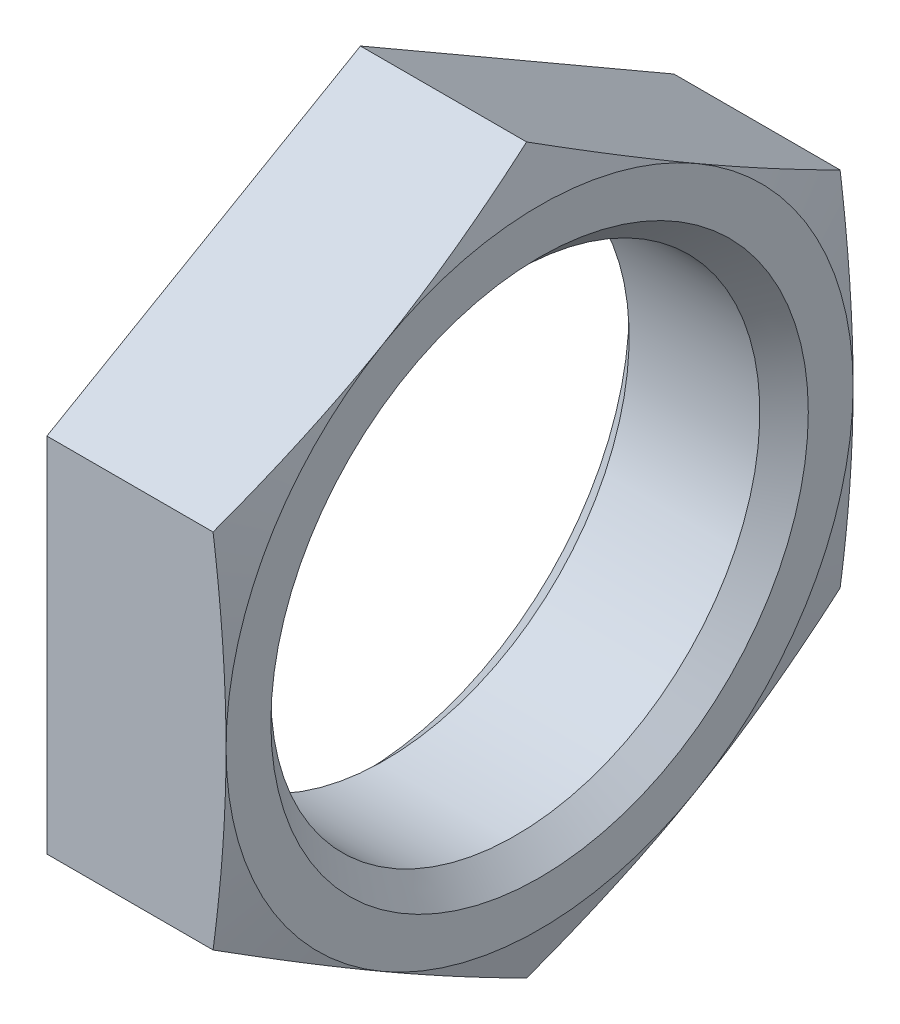
ISO-10303-21;
HEADER;
FILE_DESCRIPTION(('STEP AP214'),'2;1');
FILE_NAME('part.step','',(''),(''),'','','');
FILE_SCHEMA(('AUTOMOTIVE_DESIGN { 1 0 10303 214 1 1 1 1 }'));
ENDSEC;
DATA;
#1=APPLICATION_CONTEXT('core data for automotive mechanical design processes');
#2=APPLICATION_PROTOCOL_DEFINITION('international standard','automotive_design',2000,#1);
#3=PRODUCT_CONTEXT('',#1,'mechanical');
#4=PRODUCT('Part','Part','',(#3));
#5=PRODUCT_RELATED_PRODUCT_CATEGORY('part','',(#4));
#6=PRODUCT_DEFINITION_FORMATION('','',#4);
#7=PRODUCT_DEFINITION_CONTEXT('part definition',#1,'design');
#8=PRODUCT_DEFINITION('design','',#6,#7);
#9=PRODUCT_DEFINITION_SHAPE('','',#8);
#10=(LENGTH_UNIT() NAMED_UNIT(*) SI_UNIT(.MILLI.,.METRE.));
#11=(NAMED_UNIT(*) PLANE_ANGLE_UNIT() SI_UNIT($,.RADIAN.));
#12=(NAMED_UNIT(*) SI_UNIT($,.STERADIAN.) SOLID_ANGLE_UNIT());
#13=UNCERTAINTY_MEASURE_WITH_UNIT(LENGTH_MEASURE(1.E-05),#10,'distance_accuracy_value','');
#14=(GEOMETRIC_REPRESENTATION_CONTEXT(3) GLOBAL_UNCERTAINTY_ASSIGNED_CONTEXT((#13)) GLOBAL_UNIT_ASSIGNED_CONTEXT((#10,
#11,#12)) REPRESENTATION_CONTEXT('',''));
#15=CARTESIAN_POINT('',(0.,0.,0.));
#16=DIRECTION('',(0.,0.,1.));
#17=DIRECTION('',(1.,0.,0.));
#18=AXIS2_PLACEMENT_3D('',#15,#16,#17);
#19=CARTESIAN_POINT('',(4.,-8.0829037686548,0.));
#20=DIRECTION('',(0.,0.866025403784438,0.5));
#21=DIRECTION('',(1.,0.,0.));
#22=AXIS2_PLACEMENT_3D('',#19,#20,#21);
#23=PLANE('',#22);
#24=DIRECTION('',(0.,0.5,-0.866025403784438));
#25=VECTOR('',#24,1.);
#26=CARTESIAN_POINT('',(-2.,-6.06217782649109,-3.5));
#27=LINE('',#26,#25);
#28=CARTESIAN_POINT('',(-2.,-8.0829037686548,0.));
#29=VERTEX_POINT('',#28);
#30=CARTESIAN_POINT('',(-2.,-4.0414518843274,-7.));
#31=VERTEX_POINT('',#30);
#32=EDGE_CURVE('E362',#29,#31,#27,.T.);
#33=ORIENTED_EDGE('',*,*,#32,.T.);
#34=DIRECTION('',(-1.,0.,0.));
#35=VECTOR('',#34,1.);
#36=CARTESIAN_POINT('',(4.,-4.0414518843274,-7.));
#37=LINE('',#36,#35);
#38=CARTESIAN_POINT('',(1.70983680970831,-4.0414518843274,-7.));
#39=VERTEX_POINT('',#38);
#40=EDGE_CURVE('E11',#39,#31,#37,.T.);
#41=ORIENTED_EDGE('',*,*,#40,.F.);
#42=CARTESIAN_POINT('',(1.70983680970852,-4.04145188432742,-7.));
#43=CARTESIAN_POINT('',(2.,-5.12435565298139,-5.12435565298351));
#44=CARTESIAN_POINT('',(2.,-6.06217782649109,-3.50000000000003));
#45=B_SPLINE_CURVE_WITH_KNOTS('',2,(#42,#43,#44),.UNSPECIFIED.,.F.,.F.,(3,3),(0.,1.),.UNSPECIFIED.);
#46=CARTESIAN_POINT('',(2.,-6.06217782649109,-3.5));
#47=VERTEX_POINT('',#46);
#48=EDGE_CURVE('E130',#39,#47,#45,.T.);
#49=ORIENTED_EDGE('',*,*,#48,.T.);
#50=CARTESIAN_POINT('',(2.,-6.06217782649109,-3.50000000000003));
#51=CARTESIAN_POINT('',(2.,-7.00000000000084,-1.87564434701648));
#52=CARTESIAN_POINT('',(1.70983680970851,-8.0829037686548,0.));
#53=B_SPLINE_CURVE_WITH_KNOTS('',2,(#50,#51,#52),.UNSPECIFIED.,.F.,.F.,(3,3),(0.,1.),.UNSPECIFIED.);
#54=CARTESIAN_POINT('',(1.70983680970831,-8.0829037686548,0.));
#55=VERTEX_POINT('',#54);
#56=EDGE_CURVE('E205',#47,#55,#53,.T.);
#57=ORIENTED_EDGE('',*,*,#56,.T.);
#58=DIRECTION('',(-1.,0.,0.));
#59=VECTOR('',#58,1.);
#60=CARTESIAN_POINT('',(4.,-8.0829037686548,0.));
#61=LINE('',#60,#59);
#62=EDGE_CURVE('E167',#55,#29,#61,.T.);
#63=ORIENTED_EDGE('',*,*,#62,.T.);
#64=EDGE_LOOP('',(#33,#41,#49,#57,#63));
#65=FACE_BOUND('',#64,.T.);
#66=ADVANCED_FACE('F16',(#65),#23,.F.);
#67=CARTESIAN_POINT('',(4.,-4.0414518843274,-7.));
#68=DIRECTION('',(0.,0.,1.));
#69=DIRECTION('',(1.,0.,0.));
#70=AXIS2_PLACEMENT_3D('',#67,#68,#69);
#71=PLANE('',#70);
#72=DIRECTION('',(0.,1.,0.));
#73=VECTOR('',#72,1.);
#74=CARTESIAN_POINT('',(-2.,0.,-7.));
#75=LINE('',#74,#73);
#76=CARTESIAN_POINT('',(-2.,4.0414518843274,-7.));
#77=VERTEX_POINT('',#76);
#78=EDGE_CURVE('E353',#31,#77,#75,.T.);
#79=ORIENTED_EDGE('',*,*,#78,.T.);
#80=DIRECTION('',(-1.,0.,0.));
#81=VECTOR('',#80,1.);
#82=CARTESIAN_POINT('',(4.,4.0414518843274,-7.));
#83=LINE('',#82,#81);
#84=CARTESIAN_POINT('',(1.70983680970831,4.0414518843274,-7.));
#85=VERTEX_POINT('',#84);
#86=EDGE_CURVE('E30',#85,#77,#83,.T.);
#87=ORIENTED_EDGE('',*,*,#86,.F.);
#88=CARTESIAN_POINT('',(1.70983680970831,4.0414518843274,-7.));
#89=CARTESIAN_POINT('',(2.,1.87564434701792,-7.));
#90=CARTESIAN_POINT('',(2.,0.,-7.));
#91=B_SPLINE_CURVE_WITH_KNOTS('',2,(#88,#89,#90),.UNSPECIFIED.,.F.,.F.,(3,3),(0.,1.),.UNSPECIFIED.);
#92=CARTESIAN_POINT('',(2.,0.,-7.));
#93=VERTEX_POINT('',#92);
#94=EDGE_CURVE('E246',#85,#93,#91,.T.);
#95=ORIENTED_EDGE('',*,*,#94,.T.);
#96=CARTESIAN_POINT('',(2.,0.,-7.));
#97=CARTESIAN_POINT('',(2.,-1.87564434701782,-7.));
#98=CARTESIAN_POINT('',(1.70983680970831,-4.0414518843274,-7.));
#99=B_SPLINE_CURVE_WITH_KNOTS('',2,(#96,#97,#98),.UNSPECIFIED.,.F.,.F.,(3,3),(0.,1.),.UNSPECIFIED.);
#100=EDGE_CURVE('E339',#93,#39,#99,.T.);
#101=ORIENTED_EDGE('',*,*,#100,.T.);
#102=ORIENTED_EDGE('',*,*,#40,.T.);
#103=EDGE_LOOP('',(#79,#87,#95,#101,#102));
#104=FACE_BOUND('',#103,.T.);
#105=ADVANCED_FACE('F183',(#104),#71,.F.);
#106=CARTESIAN_POINT('',(4.,4.0414518843274,-7.));
#107=DIRECTION('',(0.,-0.866025403784438,0.5));
#108=DIRECTION('',(-1.,0.,0.));
#109=AXIS2_PLACEMENT_3D('',#106,#107,#108);
#110=PLANE('',#109);
#111=DIRECTION('',(0.,0.5,0.866025403784438));
#112=VECTOR('',#111,1.);
#113=CARTESIAN_POINT('',(-2.,6.06217782649109,-3.5));
#114=LINE('',#113,#112);
#115=CARTESIAN_POINT('',(-2.,8.0829037686548,0.));
#116=VERTEX_POINT('',#115);
#117=EDGE_CURVE('E350',#77,#116,#114,.T.);
#118=ORIENTED_EDGE('',*,*,#117,.T.);
#119=DIRECTION('',(-1.,0.,0.));
#120=VECTOR('',#119,1.);
#121=CARTESIAN_POINT('',(4.,8.0829037686548,0.));
#122=LINE('',#121,#120);
#123=CARTESIAN_POINT('',(1.70983680970831,8.0829037686548,0.));
#124=VERTEX_POINT('',#123);
#125=EDGE_CURVE('E60',#124,#116,#122,.T.);
#126=ORIENTED_EDGE('',*,*,#125,.F.);
#127=CARTESIAN_POINT('',(1.70983680970851,8.08290376865478,0.));
#128=CARTESIAN_POINT('',(2.,7.00000000000081,-1.87564434701649));
#129=CARTESIAN_POINT('',(2.,6.06217782649108,-3.50000000000003));
#130=B_SPLINE_CURVE_WITH_KNOTS('',2,(#127,#128,#129),.UNSPECIFIED.,.F.,.F.,(3,3),(0.,1.),.UNSPECIFIED.);
#131=CARTESIAN_POINT('',(2.,6.06217782649109,-3.5));
#132=VERTEX_POINT('',#131);
#133=EDGE_CURVE('E300',#124,#132,#130,.T.);
#134=ORIENTED_EDGE('',*,*,#133,.T.);
#135=CARTESIAN_POINT('',(2.,6.06217782649108,-3.50000000000003));
#136=CARTESIAN_POINT('',(2.,5.12435565298138,-5.1243556529835));
#137=CARTESIAN_POINT('',(1.70983680970852,4.0414518843274,-7.));
#138=B_SPLINE_CURVE_WITH_KNOTS('',2,(#135,#136,#137),.UNSPECIFIED.,.F.,.F.,(3,3),(0.,1.),.UNSPECIFIED.);
#139=EDGE_CURVE('E247',#132,#85,#138,.T.);
#140=ORIENTED_EDGE('',*,*,#139,.T.);
#141=ORIENTED_EDGE('',*,*,#86,.T.);
#142=EDGE_LOOP('',(#118,#126,#134,#140,#141));
#143=FACE_BOUND('',#142,.T.);
#144=ADVANCED_FACE('F309',(#143),#110,.F.);
#145=CARTESIAN_POINT('',(4.,8.0829037686548,0.));
#146=DIRECTION('',(0.,-0.866025403784438,-0.5));
#147=DIRECTION('',(0.,0.5,-0.866025403784438));
#148=AXIS2_PLACEMENT_3D('',#145,#146,#147);
#149=PLANE('',#148);
#150=DIRECTION('',(0.,-0.5,0.866025403784438));
#151=VECTOR('',#150,1.);
#152=CARTESIAN_POINT('',(-2.,6.06217782649109,3.5));
#153=LINE('',#152,#151);
#154=CARTESIAN_POINT('',(-2.,4.0414518843274,7.));
#155=VERTEX_POINT('',#154);
#156=EDGE_CURVE('E163',#116,#155,#153,.T.);
#157=ORIENTED_EDGE('',*,*,#156,.T.);
#158=DIRECTION('',(-1.,0.,0.));
#159=VECTOR('',#158,1.);
#160=CARTESIAN_POINT('',(4.,4.0414518843274,7.));
#161=LINE('',#160,#159);
#162=CARTESIAN_POINT('',(1.70983680970831,4.0414518843274,7.));
#163=VERTEX_POINT('',#162);
#164=EDGE_CURVE('E345',#163,#155,#161,.T.);
#165=ORIENTED_EDGE('',*,*,#164,.F.);
#166=CARTESIAN_POINT('',(1.70983680970852,4.04145188432742,7.));
#167=CARTESIAN_POINT('',(2.,5.12435565298139,5.12435565298351));
#168=CARTESIAN_POINT('',(2.,6.06217782649109,3.50000000000003));
#169=B_SPLINE_CURVE_WITH_KNOTS('',2,(#166,#167,#168),.UNSPECIFIED.,.F.,.F.,(3,3),(0.,1.),.UNSPECIFIED.);
#170=CARTESIAN_POINT('',(2.,6.06217782649109,3.5));
#171=VERTEX_POINT('',#170);
#172=EDGE_CURVE('E396',#163,#171,#169,.T.);
#173=ORIENTED_EDGE('',*,*,#172,.T.);
#174=CARTESIAN_POINT('',(2.,6.06217782649109,3.50000000000003));
#175=CARTESIAN_POINT('',(2.,7.00000000000084,1.87564434701648));
#176=CARTESIAN_POINT('',(1.70983680970851,8.0829037686548,0.));
#177=B_SPLINE_CURVE_WITH_KNOTS('',2,(#174,#175,#176),.UNSPECIFIED.,.F.,.F.,(3,3),(0.,1.),.UNSPECIFIED.);
#178=EDGE_CURVE('E301',#171,#124,#177,.T.);
#179=ORIENTED_EDGE('',*,*,#178,.T.);
#180=ORIENTED_EDGE('',*,*,#125,.T.);
#181=EDGE_LOOP('',(#157,#165,#173,#179,#180));
#182=FACE_BOUND('',#181,.T.);
#183=ADVANCED_FACE('F317',(#182),#149,.F.);
#184=CARTESIAN_POINT('',(4.,4.0414518843274,7.));
#185=DIRECTION('',(0.,0.,-1.));
#186=DIRECTION('',(0.,-1.,0.));
#187=AXIS2_PLACEMENT_3D('',#184,#185,#186);
#188=PLANE('',#187);
#189=DIRECTION('',(0.,-1.,0.));
#190=VECTOR('',#189,1.);
#191=CARTESIAN_POINT('',(-2.,0.,7.));
#192=LINE('',#191,#190);
#193=CARTESIAN_POINT('',(-2.,-4.0414518843274,7.));
#194=VERTEX_POINT('',#193);
#195=EDGE_CURVE('E162',#155,#194,#192,.T.);
#196=ORIENTED_EDGE('',*,*,#195,.T.);
#197=DIRECTION('',(-1.,0.,0.));
#198=VECTOR('',#197,1.);
#199=CARTESIAN_POINT('',(4.,-4.0414518843274,7.));
#200=LINE('',#199,#198);
#201=CARTESIAN_POINT('',(1.70983680970831,-4.0414518843274,7.));
#202=VERTEX_POINT('',#201);
#203=EDGE_CURVE('E116',#202,#194,#200,.T.);
#204=ORIENTED_EDGE('',*,*,#203,.F.);
#205=CARTESIAN_POINT('',(1.70983680970831,-4.0414518843274,7.));
#206=CARTESIAN_POINT('',(2.,-1.87564434701782,7.));
#207=CARTESIAN_POINT('',(2.,0.,7.));
#208=B_SPLINE_CURVE_WITH_KNOTS('',2,(#205,#206,#207),.UNSPECIFIED.,.F.,.F.,(3,3),(0.,1.),.UNSPECIFIED.);
#209=CARTESIAN_POINT('',(2.,0.,7.));
#210=VERTEX_POINT('',#209);
#211=EDGE_CURVE('E376',#202,#210,#208,.T.);
#212=ORIENTED_EDGE('',*,*,#211,.T.);
#213=CARTESIAN_POINT('',(2.,0.,7.));
#214=CARTESIAN_POINT('',(2.,1.87564434701791,7.));
#215=CARTESIAN_POINT('',(1.70983680970831,4.0414518843274,7.));
#216=B_SPLINE_CURVE_WITH_KNOTS('',2,(#213,#214,#215),.UNSPECIFIED.,.F.,.F.,(3,3),(0.,1.),.UNSPECIFIED.);
#217=EDGE_CURVE('E381',#210,#163,#216,.T.);
#218=ORIENTED_EDGE('',*,*,#217,.T.);
#219=ORIENTED_EDGE('',*,*,#164,.T.);
#220=EDGE_LOOP('',(#196,#204,#212,#218,#219));
#221=FACE_BOUND('',#220,.T.);
#222=ADVANCED_FACE('F427',(#221),#188,.F.);
#223=CARTESIAN_POINT('',(4.,-4.0414518843274,7.));
#224=DIRECTION('',(0.,0.866025403784438,-0.5));
#225=DIRECTION('',(-1.,0.,0.));
#226=AXIS2_PLACEMENT_3D('',#223,#224,#225);
#227=PLANE('',#226);
#228=DIRECTION('',(0.,-0.5,-0.866025403784438));
#229=VECTOR('',#228,1.);
#230=CARTESIAN_POINT('',(-2.,-6.06217782649109,3.5));
#231=LINE('',#230,#229);
#232=EDGE_CURVE('E164',#194,#29,#231,.T.);
#233=ORIENTED_EDGE('',*,*,#232,.T.);
#234=ORIENTED_EDGE('',*,*,#62,.F.);
#235=CARTESIAN_POINT('',(1.70983680970851,-8.08290376865478,0.));
#236=CARTESIAN_POINT('',(2.,-7.00000000000081,1.87564434701649));
#237=CARTESIAN_POINT('',(2.,-6.06217782649108,3.50000000000003));
#238=B_SPLINE_CURVE_WITH_KNOTS('',2,(#235,#236,#237),.UNSPECIFIED.,.F.,.F.,(3,3),(0.,1.),.UNSPECIFIED.);
#239=CARTESIAN_POINT('',(2.,-6.06217782649109,3.5));
#240=VERTEX_POINT('',#239);
#241=EDGE_CURVE('E447',#55,#240,#238,.T.);
#242=ORIENTED_EDGE('',*,*,#241,.T.);
#243=CARTESIAN_POINT('',(2.,-6.06217782649108,3.50000000000003));
#244=CARTESIAN_POINT('',(2.,-5.12435565298138,5.1243556529835));
#245=CARTESIAN_POINT('',(1.70983680970852,-4.0414518843274,7.));
#246=B_SPLINE_CURVE_WITH_KNOTS('',2,(#243,#244,#245),.UNSPECIFIED.,.F.,.F.,(3,3),(0.,1.),.UNSPECIFIED.);
#247=EDGE_CURVE('E377',#240,#202,#246,.T.);
#248=ORIENTED_EDGE('',*,*,#247,.T.);
#249=ORIENTED_EDGE('',*,*,#203,.T.);
#250=EDGE_LOOP('',(#233,#234,#242,#248,#249));
#251=FACE_BOUND('',#250,.T.);
#252=ADVANCED_FACE('F18',(#251),#227,.F.);
#253=CARTESIAN_POINT('',(1.4585,0.,0.));
#254=DIRECTION('',(1.,0.,0.));
#255=DIRECTION('',(0.,0.,-1.));
#256=AXIS2_PLACEMENT_3D('',#253,#254,#255);
#257=CONICAL_SURFACE('',#256,5.4585,0.7853981625);
#258=CARTESIAN_POINT('',(1.4585,0.,0.));
#259=DIRECTION('',(-1.,0.,0.));
#260=DIRECTION('',(0.,0.,1.));
#261=AXIS2_PLACEMENT_3D('',#258,#259,#260);
#262=CIRCLE('',#261,5.4585);
#263=CARTESIAN_POINT('',(1.4585,0.,5.4585));
#264=VERTEX_POINT('',#263);
#265=EDGE_CURVE('E42',#264,#264,#262,.T.);
#266=ORIENTED_EDGE('',*,*,#265,.T.);
#267=EDGE_LOOP('',(#266));
#268=FACE_BOUND('',#267,.T.);
#269=CARTESIAN_POINT('',(2.,0.,0.));
#270=DIRECTION('',(-1.,0.,0.));
#271=DIRECTION('',(0.,0.,1.));
#272=AXIS2_PLACEMENT_3D('',#269,#270,#271);
#273=CIRCLE('',#272,6.);
#274=CARTESIAN_POINT('',(2.,0.,6.));
#275=VERTEX_POINT('',#274);
#276=EDGE_CURVE('E145',#275,#275,#273,.T.);
#277=ORIENTED_EDGE('',*,*,#276,.F.);
#278=EDGE_LOOP('',(#277));
#279=FACE_BOUND('',#278,.T.);
#280=ADVANCED_FACE('F575',(#268,#279),#257,.F.);
#281=CARTESIAN_POINT('',(2.,0.,0.));
#282=DIRECTION('',(-1.,0.,0.));
#283=DIRECTION('',(0.,0.,1.));
#284=AXIS2_PLACEMENT_3D('',#281,#282,#283);
#285=CYLINDRICAL_SURFACE('',#284,5.4585);
#286=CARTESIAN_POINT('',(-1.4585,0.,0.));
#287=DIRECTION('',(-1.,0.,0.));
#288=DIRECTION('',(0.,0.,1.));
#289=AXIS2_PLACEMENT_3D('',#286,#287,#288);
#290=CIRCLE('',#289,5.4585);
#291=CARTESIAN_POINT('',(-1.4585,0.,5.4585));
#292=VERTEX_POINT('',#291);
#293=EDGE_CURVE('E149',#292,#292,#290,.T.);
#294=ORIENTED_EDGE('',*,*,#293,.T.);
#295=EDGE_LOOP('',(#294));
#296=FACE_BOUND('',#295,.T.);
#297=ORIENTED_EDGE('',*,*,#265,.F.);
#298=EDGE_LOOP('',(#297));
#299=FACE_BOUND('',#298,.T.);
#300=ADVANCED_FACE('F184',(#296,#299),#285,.F.);
#301=CARTESIAN_POINT('',(-2.,0.,0.));
#302=DIRECTION('',(-1.,0.,0.));
#303=DIRECTION('',(0.,0.,1.));
#304=AXIS2_PLACEMENT_3D('',#301,#302,#303);
#305=CONICAL_SURFACE('',#304,6.,0.7853981625);
#306=CARTESIAN_POINT('',(-2.,0.,0.));
#307=DIRECTION('',(-1.,0.,0.));
#308=DIRECTION('',(0.,0.,1.));
#309=AXIS2_PLACEMENT_3D('',#306,#307,#308);
#310=CIRCLE('',#309,6.);
#311=CARTESIAN_POINT('',(-2.,0.,6.));
#312=VERTEX_POINT('',#311);
#313=EDGE_CURVE('E160',#312,#312,#310,.T.);
#314=ORIENTED_EDGE('',*,*,#313,.T.);
#315=EDGE_LOOP('',(#314));
#316=FACE_BOUND('',#315,.T.);
#317=ORIENTED_EDGE('',*,*,#293,.F.);
#318=EDGE_LOOP('',(#317));
#319=FACE_BOUND('',#318,.T.);
#320=ADVANCED_FACE('F284',(#316,#319),#305,.F.);
#321=CARTESIAN_POINT('',(2.,7.,0.));
#322=DIRECTION('',(1.,0.,0.));
#323=DIRECTION('',(0.,1.,0.));
#324=AXIS2_PLACEMENT_3D('',#321,#322,#323);
#325=PLANE('',#324);
#326=CARTESIAN_POINT('',(2.,0.,0.));
#327=DIRECTION('',(-1.,0.,0.));
#328=DIRECTION('',(0.,0.,1.));
#329=AXIS2_PLACEMENT_3D('',#326,#327,#328);
#330=CIRCLE('',#329,7.);
#331=EDGE_CURVE('E391',#210,#171,#330,.T.);
#332=ORIENTED_EDGE('',*,*,#331,.F.);
#333=CARTESIAN_POINT('',(2.,0.,0.));
#334=DIRECTION('',(-1.,0.,0.));
#335=DIRECTION('',(0.,0.,1.));
#336=AXIS2_PLACEMENT_3D('',#333,#334,#335);
#337=CIRCLE('',#336,7.);
#338=EDGE_CURVE('E372',#240,#210,#337,.T.);
#339=ORIENTED_EDGE('',*,*,#338,.F.);
#340=CARTESIAN_POINT('',(2.,0.,0.));
#341=DIRECTION('',(-1.,0.,0.));
#342=DIRECTION('',(0.,0.,1.));
#343=AXIS2_PLACEMENT_3D('',#340,#341,#342);
#344=CIRCLE('',#343,7.);
#345=EDGE_CURVE('E385',#47,#240,#344,.T.);
#346=ORIENTED_EDGE('',*,*,#345,.F.);
#347=CARTESIAN_POINT('',(2.,0.,0.));
#348=DIRECTION('',(-1.,0.,0.));
#349=DIRECTION('',(0.,0.,1.));
#350=AXIS2_PLACEMENT_3D('',#347,#348,#349);
#351=CIRCLE('',#350,7.);
#352=EDGE_CURVE('E157',#93,#47,#351,.T.);
#353=ORIENTED_EDGE('',*,*,#352,.F.);
#354=CARTESIAN_POINT('',(2.,0.,0.));
#355=DIRECTION('',(-1.,0.,0.));
#356=DIRECTION('',(0.,0.,1.));
#357=AXIS2_PLACEMENT_3D('',#354,#355,#356);
#358=CIRCLE('',#357,7.);
#359=EDGE_CURVE('E237',#132,#93,#358,.T.);
#360=ORIENTED_EDGE('',*,*,#359,.F.);
#361=CARTESIAN_POINT('',(2.,0.,0.));
#362=DIRECTION('',(-1.,0.,0.));
#363=DIRECTION('',(0.,0.,1.));
#364=AXIS2_PLACEMENT_3D('',#361,#362,#363);
#365=CIRCLE('',#364,7.);
#366=EDGE_CURVE('E75',#171,#132,#365,.T.);
#367=ORIENTED_EDGE('',*,*,#366,.F.);
#368=EDGE_LOOP('',(#332,#339,#346,#353,#360,#367));
#369=FACE_BOUND('',#368,.T.);
#370=ORIENTED_EDGE('',*,*,#276,.T.);
#371=EDGE_LOOP('',(#370));
#372=FACE_BOUND('',#371,.T.);
#373=ADVANCED_FACE('F146',(#369,#372),#325,.T.);
#374=CARTESIAN_POINT('',(1.6248711305964,0.,0.));
#375=DIRECTION('',(-1.,0.,0.));
#376=DIRECTION('',(0.,0.,1.));
#377=AXIS2_PLACEMENT_3D('',#374,#375,#376);
#378=CONICAL_SURFACE('',#377,8.4,1.30899693749998);
#379=ORIENTED_EDGE('',*,*,#100,.F.);
#380=ORIENTED_EDGE('',*,*,#352,.T.);
#381=ORIENTED_EDGE('',*,*,#48,.F.);
#382=EDGE_LOOP('',(#379,#380,#381));
#383=FACE_BOUND('',#382,.T.);
#384=ADVANCED_FACE('F222',(#383),#378,.T.);
#385=CARTESIAN_POINT('',(-2.,0.,0.));
#386=DIRECTION('',(-1.,0.,0.));
#387=DIRECTION('',(0.,0.,1.));
#388=AXIS2_PLACEMENT_3D('',#385,#386,#387);
#389=PLANE('',#388);
#390=ORIENTED_EDGE('',*,*,#313,.F.);
#391=EDGE_LOOP('',(#390));
#392=FACE_BOUND('',#391,.T.);
#393=ORIENTED_EDGE('',*,*,#232,.F.);
#394=ORIENTED_EDGE('',*,*,#195,.F.);
#395=ORIENTED_EDGE('',*,*,#156,.F.);
#396=ORIENTED_EDGE('',*,*,#117,.F.);
#397=ORIENTED_EDGE('',*,*,#78,.F.);
#398=ORIENTED_EDGE('',*,*,#32,.F.);
#399=EDGE_LOOP('',(#393,#394,#395,#396,#397,#398));
#400=FACE_BOUND('',#399,.T.);
#401=ADVANCED_FACE('F186',(#392,#400),#389,.T.);
#402=CARTESIAN_POINT('',(1.6248711305964,0.,0.));
#403=DIRECTION('',(-1.,0.,0.));
#404=DIRECTION('',(0.,0.,1.));
#405=AXIS2_PLACEMENT_3D('',#402,#403,#404);
#406=CONICAL_SURFACE('',#405,8.4,1.30899693749998);
#407=ORIENTED_EDGE('',*,*,#139,.F.);
#408=ORIENTED_EDGE('',*,*,#359,.T.);
#409=ORIENTED_EDGE('',*,*,#94,.F.);
#410=EDGE_LOOP('',(#407,#408,#409));
#411=FACE_BOUND('',#410,.T.);
#412=ADVANCED_FACE('F272',(#411),#406,.T.);
#413=CARTESIAN_POINT('',(1.6248711305964,0.,0.));
#414=DIRECTION('',(-1.,0.,0.));
#415=DIRECTION('',(0.,0.,1.));
#416=AXIS2_PLACEMENT_3D('',#413,#414,#415);
#417=CONICAL_SURFACE('',#416,8.4,1.30899693749998);
#418=ORIENTED_EDGE('',*,*,#178,.F.);
#419=ORIENTED_EDGE('',*,*,#366,.T.);
#420=ORIENTED_EDGE('',*,*,#133,.F.);
#421=EDGE_LOOP('',(#418,#419,#420));
#422=FACE_BOUND('',#421,.T.);
#423=ADVANCED_FACE('F282',(#422),#417,.T.);
#424=CARTESIAN_POINT('',(1.6248711305964,0.,0.));
#425=DIRECTION('',(-1.,0.,0.));
#426=DIRECTION('',(0.,0.,1.));
#427=AXIS2_PLACEMENT_3D('',#424,#425,#426);
#428=CONICAL_SURFACE('',#427,8.4,1.30899693749998);
#429=ORIENTED_EDGE('',*,*,#217,.F.);
#430=ORIENTED_EDGE('',*,*,#331,.T.);
#431=ORIENTED_EDGE('',*,*,#172,.F.);
#432=EDGE_LOOP('',(#429,#430,#431));
#433=FACE_BOUND('',#432,.T.);
#434=ADVANCED_FACE('F318',(#433),#428,.T.);
#435=CARTESIAN_POINT('',(1.6248711305964,0.,0.));
#436=DIRECTION('',(-1.,0.,0.));
#437=DIRECTION('',(0.,0.,1.));
#438=AXIS2_PLACEMENT_3D('',#435,#436,#437);
#439=CONICAL_SURFACE('',#438,8.4,1.30899693749998);
#440=ORIENTED_EDGE('',*,*,#247,.F.);
#441=ORIENTED_EDGE('',*,*,#338,.T.);
#442=ORIENTED_EDGE('',*,*,#211,.F.);
#443=EDGE_LOOP('',(#440,#441,#442));
#444=FACE_BOUND('',#443,.T.);
#445=ADVANCED_FACE('F219',(#444),#439,.T.);
#446=CARTESIAN_POINT('',(1.6248711305964,0.,0.));
#447=DIRECTION('',(-1.,0.,0.));
#448=DIRECTION('',(0.,0.,1.));
#449=AXIS2_PLACEMENT_3D('',#446,#447,#448);
#450=CONICAL_SURFACE('',#449,8.4,1.30899693749998);
#451=ORIENTED_EDGE('',*,*,#241,.F.);
#452=ORIENTED_EDGE('',*,*,#56,.F.);
#453=ORIENTED_EDGE('',*,*,#345,.T.);
#454=EDGE_LOOP('',(#451,#452,#453));
#455=FACE_BOUND('',#454,.T.);
#456=ADVANCED_FACE('F210',(#455),#450,.T.);
#457=CLOSED_SHELL('',(#66,#105,#144,#183,#222,#252,#280,#300,#320,#373,#384,#401,#412,#423,#434,
#445,#456));
#458=MANIFOLD_SOLID_BREP('B1',#457);
#459=ADVANCED_BREP_SHAPE_REPRESENTATION('',(#18,#458),#14);
#460=SHAPE_DEFINITION_REPRESENTATION(#9,#459);
ENDSEC;
END-ISO-10303-21;
